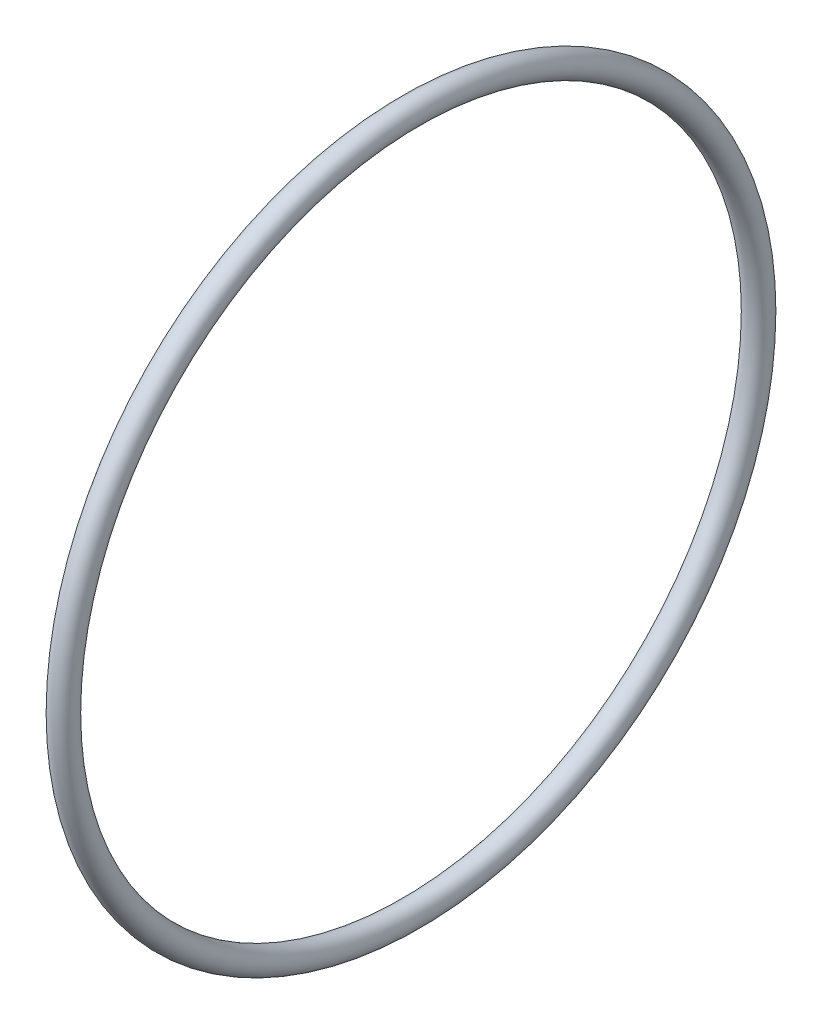
ISO-10303-21;
HEADER;
FILE_DESCRIPTION(('STEP AP214'),'2;1');
FILE_NAME('part.step','',(''),(''),'','','');
FILE_SCHEMA(('AUTOMOTIVE_DESIGN { 1 0 10303 214 1 1 1 1 }'));
ENDSEC;
DATA;
#1=APPLICATION_CONTEXT('core data for automotive mechanical design processes');
#2=APPLICATION_PROTOCOL_DEFINITION('international standard','automotive_design',2000,#1);
#3=PRODUCT_CONTEXT('',#1,'mechanical');
#4=PRODUCT('Part','Part','',(#3));
#5=PRODUCT_RELATED_PRODUCT_CATEGORY('part','',(#4));
#6=PRODUCT_DEFINITION_FORMATION('','',#4);
#7=PRODUCT_DEFINITION_CONTEXT('part definition',#1,'design');
#8=PRODUCT_DEFINITION('design','',#6,#7);
#9=PRODUCT_DEFINITION_SHAPE('','',#8);
#10=(LENGTH_UNIT() NAMED_UNIT(*) SI_UNIT(.MILLI.,.METRE.));
#11=(NAMED_UNIT(*) PLANE_ANGLE_UNIT() SI_UNIT($,.RADIAN.));
#12=(NAMED_UNIT(*) SI_UNIT($,.STERADIAN.) SOLID_ANGLE_UNIT());
#13=UNCERTAINTY_MEASURE_WITH_UNIT(LENGTH_MEASURE(1.E-05),#10,'distance_accuracy_value','');
#14=(GEOMETRIC_REPRESENTATION_CONTEXT(3) GLOBAL_UNCERTAINTY_ASSIGNED_CONTEXT((#13)) GLOBAL_UNIT_ASSIGNED_CONTEXT((#10,
#11,#12)) REPRESENTATION_CONTEXT('',''));
#15=CARTESIAN_POINT('',(0.,0.,0.));
#16=DIRECTION('',(0.,0.,1.));
#17=DIRECTION('',(1.,0.,0.));
#18=AXIS2_PLACEMENT_3D('',#15,#16,#17);
#19=CARTESIAN_POINT('',(0.,0.,0.));
#20=DIRECTION('',(-1.,0.,0.));
#21=DIRECTION('',(0.,0.,1.));
#22=AXIS2_PLACEMENT_3D('',#19,#20,#21);
#23=TOROIDAL_SURFACE('',#22,44.05,1.55);
#24=CARTESIAN_POINT('',(0.,0.,45.6));
#25=VERTEX_POINT('',#24);
#26=VERTEX_LOOP('',#25);
#27=FACE_BOUND('',#26,.T.);
#28=ADVANCED_FACE('F35',(#27),#23,.T.);
#29=CLOSED_SHELL('',(#28));
#30=MANIFOLD_SOLID_BREP('B2',#29);
#31=ADVANCED_BREP_SHAPE_REPRESENTATION('',(#18,#30),#14);
#32=SHAPE_DEFINITION_REPRESENTATION(#9,#31);
ENDSEC;
END-ISO-10303-21;
